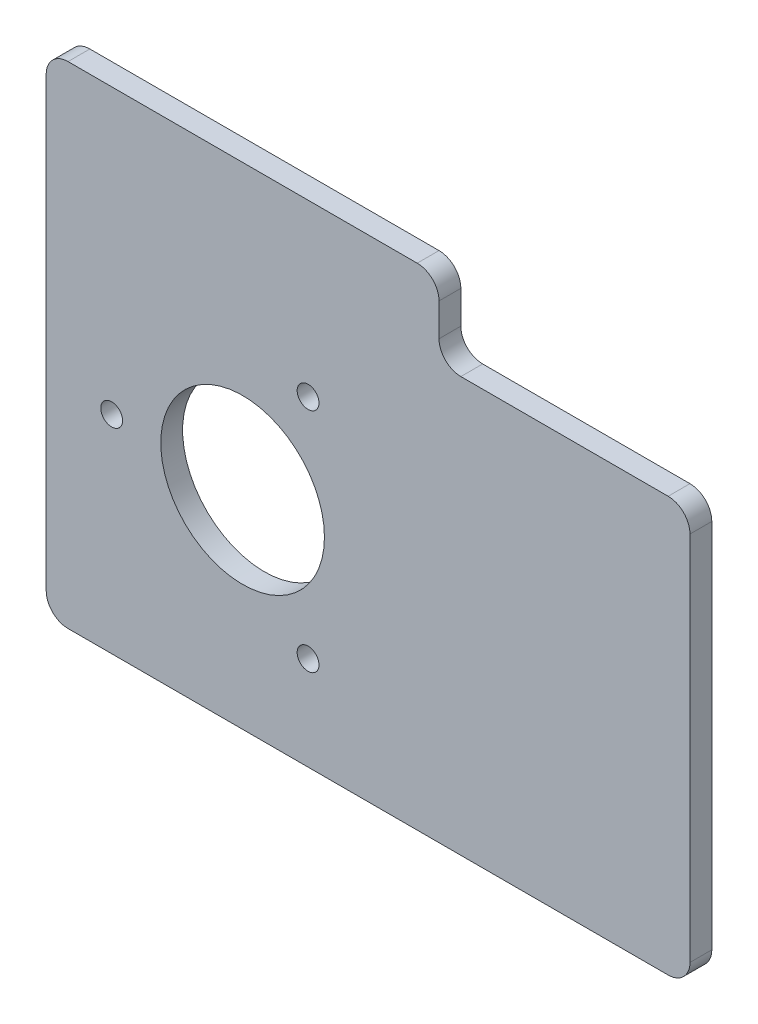
ISO-10303-21;
HEADER;
FILE_DESCRIPTION(('STEP AP214'),'2;1');
FILE_NAME('part.step','',(''),(''),'','','');
FILE_SCHEMA(('AUTOMOTIVE_DESIGN { 1 0 10303 214 1 1 1 1 }'));
ENDSEC;
DATA;
#1=APPLICATION_CONTEXT('core data for automotive mechanical design processes');
#2=APPLICATION_PROTOCOL_DEFINITION('international standard','automotive_design',2000,#1);
#3=PRODUCT_CONTEXT('',#1,'mechanical');
#4=PRODUCT('Part','Part','',(#3));
#5=PRODUCT_RELATED_PRODUCT_CATEGORY('part','',(#4));
#6=PRODUCT_DEFINITION_FORMATION('','',#4);
#7=PRODUCT_DEFINITION_CONTEXT('part definition',#1,'design');
#8=PRODUCT_DEFINITION('design','',#6,#7);
#9=PRODUCT_DEFINITION_SHAPE('','',#8);
#10=(LENGTH_UNIT() NAMED_UNIT(*) SI_UNIT(.MILLI.,.METRE.));
#11=(NAMED_UNIT(*) PLANE_ANGLE_UNIT() SI_UNIT($,.RADIAN.));
#12=(NAMED_UNIT(*) SI_UNIT($,.STERADIAN.) SOLID_ANGLE_UNIT());
#13=UNCERTAINTY_MEASURE_WITH_UNIT(LENGTH_MEASURE(1.E-05),#10,'distance_accuracy_value','');
#14=(GEOMETRIC_REPRESENTATION_CONTEXT(3) GLOBAL_UNCERTAINTY_ASSIGNED_CONTEXT((#13)) GLOBAL_UNIT_ASSIGNED_CONTEXT((#10,
#11,#12)) REPRESENTATION_CONTEXT('',''));
#15=CARTESIAN_POINT('',(0.,0.,0.));
#16=DIRECTION('',(0.,0.,1.));
#17=DIRECTION('',(1.,0.,0.));
#18=AXIS2_PLACEMENT_3D('',#15,#16,#17);
#19=CARTESIAN_POINT('',(0.,0.,1.));
#20=DIRECTION('',(0.,0.,-1.));
#21=DIRECTION('',(-1.,0.,0.));
#22=AXIS2_PLACEMENT_3D('',#19,#20,#21);
#23=PLANE('',#22);
#24=DIRECTION('',(1.,0.,0.));
#25=VECTOR('',#24,1.);
#26=CARTESIAN_POINT('',(-9.,-9.5,1.));
#27=LINE('',#26,#25);
#28=CARTESIAN_POINT('',(-8.,-9.5,1.));
#29=VERTEX_POINT('',#28);
#30=CARTESIAN_POINT('',(19.5,-9.5,1.));
#31=VERTEX_POINT('',#30);
#32=EDGE_CURVE('E242',#29,#31,#27,.T.);
#33=ORIENTED_EDGE('',*,*,#32,.T.);
#34=CARTESIAN_POINT('',(19.5,-8.49999999999999,1.));
#35=DIRECTION('',(0.,0.,-1.));
#36=DIRECTION('',(-1.,0.,0.));
#37=AXIS2_PLACEMENT_3D('',#34,#35,#36);
#38=CIRCLE('',#37,1.);
#39=CARTESIAN_POINT('',(20.5,-8.49999999999999,1.));
#40=VERTEX_POINT('',#39);
#41=EDGE_CURVE('E188',#31,#40,#38,.F.);
#42=ORIENTED_EDGE('',*,*,#41,.T.);
#43=DIRECTION('',(0.,1.,0.));
#44=VECTOR('',#43,1.);
#45=CARTESIAN_POINT('',(20.5,9.5,1.));
#46=LINE('',#45,#44);
#47=CARTESIAN_POINT('',(20.5,8.5,1.));
#48=VERTEX_POINT('',#47);
#49=EDGE_CURVE('E150',#40,#48,#46,.T.);
#50=ORIENTED_EDGE('',*,*,#49,.T.);
#51=CARTESIAN_POINT('',(19.5,8.5,1.));
#52=DIRECTION('',(0.,0.,-1.));
#53=DIRECTION('',(-1.,0.,0.));
#54=AXIS2_PLACEMENT_3D('',#51,#52,#53);
#55=CIRCLE('',#54,1.);
#56=CARTESIAN_POINT('',(19.5,9.5,1.));
#57=VERTEX_POINT('',#56);
#58=EDGE_CURVE('E182',#48,#57,#55,.F.);
#59=ORIENTED_EDGE('',*,*,#58,.T.);
#60=DIRECTION('',(-1.,0.,0.));
#61=VECTOR('',#60,1.);
#62=CARTESIAN_POINT('',(9.,9.5,1.));
#63=LINE('',#62,#61);
#64=CARTESIAN_POINT('',(10.,9.5,1.));
#65=VERTEX_POINT('',#64);
#66=EDGE_CURVE('E219',#57,#65,#63,.T.);
#67=ORIENTED_EDGE('',*,*,#66,.T.);
#68=CARTESIAN_POINT('',(10.,10.5,1.));
#69=DIRECTION('',(0.,0.,-1.));
#70=DIRECTION('',(-1.,0.,0.));
#71=AXIS2_PLACEMENT_3D('',#68,#69,#70);
#72=CIRCLE('',#71,1.);
#73=CARTESIAN_POINT('',(9.,10.5,1.));
#74=VERTEX_POINT('',#73);
#75=EDGE_CURVE('E11',#65,#74,#72,.T.);
#76=ORIENTED_EDGE('',*,*,#75,.T.);
#77=DIRECTION('',(0.,1.,0.));
#78=VECTOR('',#77,1.);
#79=CARTESIAN_POINT('',(9.,13.,1.));
#80=LINE('',#79,#78);
#81=CARTESIAN_POINT('',(9.,12.,1.));
#82=VERTEX_POINT('',#81);
#83=EDGE_CURVE('E170',#74,#82,#80,.T.);
#84=ORIENTED_EDGE('',*,*,#83,.T.);
#85=CARTESIAN_POINT('',(8.,12.,1.));
#86=DIRECTION('',(0.,0.,-1.));
#87=DIRECTION('',(-1.,0.,0.));
#88=AXIS2_PLACEMENT_3D('',#85,#86,#87);
#89=CIRCLE('',#88,1.);
#90=CARTESIAN_POINT('',(8.,13.,1.));
#91=VERTEX_POINT('',#90);
#92=EDGE_CURVE('E180',#82,#91,#89,.F.);
#93=ORIENTED_EDGE('',*,*,#92,.T.);
#94=DIRECTION('',(-1.,0.,0.));
#95=VECTOR('',#94,1.);
#96=CARTESIAN_POINT('',(-9.,13.,1.));
#97=LINE('',#96,#95);
#98=CARTESIAN_POINT('',(-8.,13.,1.));
#99=VERTEX_POINT('',#98);
#100=EDGE_CURVE('E169',#91,#99,#97,.T.);
#101=ORIENTED_EDGE('',*,*,#100,.T.);
#102=CARTESIAN_POINT('',(-8.,12.,1.));
#103=DIRECTION('',(0.,0.,-1.));
#104=DIRECTION('',(-1.,0.,0.));
#105=AXIS2_PLACEMENT_3D('',#102,#103,#104);
#106=CIRCLE('',#105,1.);
#107=CARTESIAN_POINT('',(-9.,12.,1.));
#108=VERTEX_POINT('',#107);
#109=EDGE_CURVE('E184',#99,#108,#106,.F.);
#110=ORIENTED_EDGE('',*,*,#109,.T.);
#111=DIRECTION('',(0.,-1.,0.));
#112=VECTOR('',#111,1.);
#113=CARTESIAN_POINT('',(-9.,13.,1.));
#114=LINE('',#113,#112);
#115=CARTESIAN_POINT('',(-9.,-8.49999999999999,1.));
#116=VERTEX_POINT('',#115);
#117=EDGE_CURVE('E243',#108,#116,#114,.T.);
#118=ORIENTED_EDGE('',*,*,#117,.T.);
#119=CARTESIAN_POINT('',(-8.,-8.5,1.));
#120=DIRECTION('',(0.,0.,-1.));
#121=DIRECTION('',(-1.,0.,0.));
#122=AXIS2_PLACEMENT_3D('',#119,#120,#121);
#123=CIRCLE('',#122,1.);
#124=EDGE_CURVE('E186',#116,#29,#123,.F.);
#125=ORIENTED_EDGE('',*,*,#124,.T.);
#126=EDGE_LOOP('',(#33,#42,#50,#59,#67,#76,#84,#93,#101,#110,#118,#125));
#127=FACE_BOUND('',#126,.T.);
#128=CARTESIAN_POINT('',(-6.,0.,1.));
#129=DIRECTION('',(0.,0.,1.));
#130=DIRECTION('',(1.,0.,0.));
#131=AXIS2_PLACEMENT_3D('',#128,#129,#130);
#132=CIRCLE('',#131,0.500000000000001);
#133=CARTESIAN_POINT('',(-5.5,0.,1.));
#134=VERTEX_POINT('',#133);
#135=EDGE_CURVE('E226',#134,#134,#132,.T.);
#136=ORIENTED_EDGE('',*,*,#135,.F.);
#137=EDGE_LOOP('',(#136));
#138=FACE_BOUND('',#137,.T.);
#139=CARTESIAN_POINT('',(0.,0.,1.));
#140=DIRECTION('',(0.,0.,1.));
#141=DIRECTION('',(1.,0.,0.));
#142=AXIS2_PLACEMENT_3D('',#139,#140,#141);
#143=CIRCLE('',#142,3.75);
#144=CARTESIAN_POINT('',(3.75,0.,1.));
#145=VERTEX_POINT('',#144);
#146=EDGE_CURVE('E254',#145,#145,#143,.T.);
#147=ORIENTED_EDGE('',*,*,#146,.F.);
#148=EDGE_LOOP('',(#147));
#149=FACE_BOUND('',#148,.T.);
#150=CARTESIAN_POINT('',(3.,5.19615242270663,1.));
#151=DIRECTION('',(0.,0.,1.));
#152=DIRECTION('',(1.,0.,0.));
#153=AXIS2_PLACEMENT_3D('',#150,#151,#152);
#154=CIRCLE('',#153,0.500000000000001);
#155=CARTESIAN_POINT('',(3.5,5.19615242270663,1.));
#156=VERTEX_POINT('',#155);
#157=EDGE_CURVE('E260',#156,#156,#154,.T.);
#158=ORIENTED_EDGE('',*,*,#157,.F.);
#159=EDGE_LOOP('',(#158));
#160=FACE_BOUND('',#159,.T.);
#161=CARTESIAN_POINT('',(3.,-5.19615242270663,1.));
#162=DIRECTION('',(0.,0.,1.));
#163=DIRECTION('',(1.,0.,0.));
#164=AXIS2_PLACEMENT_3D('',#161,#162,#163);
#165=CIRCLE('',#164,0.500000000000001);
#166=CARTESIAN_POINT('',(3.5,-5.19615242270663,1.));
#167=VERTEX_POINT('',#166);
#168=EDGE_CURVE('E266',#167,#167,#165,.T.);
#169=ORIENTED_EDGE('',*,*,#168,.F.);
#170=EDGE_LOOP('',(#169));
#171=FACE_BOUND('',#170,.T.);
#172=ADVANCED_FACE('F41',(#127,#138,#149,#160,#171),#23,.F.);
#173=CARTESIAN_POINT('',(0.,0.,0.));
#174=DIRECTION('',(0.,0.,-1.));
#175=DIRECTION('',(-1.,0.,0.));
#176=AXIS2_PLACEMENT_3D('',#173,#174,#175);
#177=PLANE('',#176);
#178=CARTESIAN_POINT('',(3.,5.19615242270663,0.));
#179=DIRECTION('',(0.,0.,1.));
#180=DIRECTION('',(1.,0.,0.));
#181=AXIS2_PLACEMENT_3D('',#178,#179,#180);
#182=CIRCLE('',#181,0.500000000000001);
#183=CARTESIAN_POINT('',(3.5,5.19615242270663,0.));
#184=VERTEX_POINT('',#183);
#185=EDGE_CURVE('E263',#184,#184,#182,.T.);
#186=ORIENTED_EDGE('',*,*,#185,.T.);
#187=EDGE_LOOP('',(#186));
#188=FACE_BOUND('',#187,.T.);
#189=CARTESIAN_POINT('',(-6.,0.,0.));
#190=DIRECTION('',(0.,0.,1.));
#191=DIRECTION('',(1.,0.,0.));
#192=AXIS2_PLACEMENT_3D('',#189,#190,#191);
#193=CIRCLE('',#192,0.500000000000001);
#194=CARTESIAN_POINT('',(-5.5,0.,0.));
#195=VERTEX_POINT('',#194);
#196=EDGE_CURVE('E251',#195,#195,#193,.T.);
#197=ORIENTED_EDGE('',*,*,#196,.T.);
#198=EDGE_LOOP('',(#197));
#199=FACE_BOUND('',#198,.T.);
#200=DIRECTION('',(0.,1.,0.));
#201=VECTOR('',#200,1.);
#202=CARTESIAN_POINT('',(20.5,9.5,0.));
#203=LINE('',#202,#201);
#204=CARTESIAN_POINT('',(20.5,-8.49999999999999,0.));
#205=VERTEX_POINT('',#204);
#206=CARTESIAN_POINT('',(20.5,8.5,0.));
#207=VERTEX_POINT('',#206);
#208=EDGE_CURVE('E147',#205,#207,#203,.T.);
#209=ORIENTED_EDGE('',*,*,#208,.F.);
#210=CARTESIAN_POINT('',(19.5,-8.49999999999999,0.));
#211=DIRECTION('',(0.,0.,-1.));
#212=DIRECTION('',(-1.,0.,0.));
#213=AXIS2_PLACEMENT_3D('',#210,#211,#212);
#214=CIRCLE('',#213,1.);
#215=CARTESIAN_POINT('',(19.5,-9.5,0.));
#216=VERTEX_POINT('',#215);
#217=EDGE_CURVE('E130',#205,#216,#214,.T.);
#218=ORIENTED_EDGE('',*,*,#217,.T.);
#219=DIRECTION('',(1.,0.,0.));
#220=VECTOR('',#219,1.);
#221=CARTESIAN_POINT('',(-9.,-9.5,0.));
#222=LINE('',#221,#220);
#223=CARTESIAN_POINT('',(-8.,-9.5,0.));
#224=VERTEX_POINT('',#223);
#225=EDGE_CURVE('E159',#224,#216,#222,.T.);
#226=ORIENTED_EDGE('',*,*,#225,.F.);
#227=CARTESIAN_POINT('',(-8.,-8.5,0.));
#228=DIRECTION('',(0.,0.,-1.));
#229=DIRECTION('',(-1.,0.,0.));
#230=AXIS2_PLACEMENT_3D('',#227,#228,#229);
#231=CIRCLE('',#230,1.);
#232=CARTESIAN_POINT('',(-9.,-8.49999999999999,0.));
#233=VERTEX_POINT('',#232);
#234=EDGE_CURVE('E141',#224,#233,#231,.T.);
#235=ORIENTED_EDGE('',*,*,#234,.T.);
#236=DIRECTION('',(0.,-1.,0.));
#237=VECTOR('',#236,1.);
#238=CARTESIAN_POINT('',(-9.,13.,0.));
#239=LINE('',#238,#237);
#240=CARTESIAN_POINT('',(-9.,12.,0.));
#241=VERTEX_POINT('',#240);
#242=EDGE_CURVE('E164',#241,#233,#239,.T.);
#243=ORIENTED_EDGE('',*,*,#242,.F.);
#244=CARTESIAN_POINT('',(-8.,12.,0.));
#245=DIRECTION('',(0.,0.,-1.));
#246=DIRECTION('',(-1.,0.,0.));
#247=AXIS2_PLACEMENT_3D('',#244,#245,#246);
#248=CIRCLE('',#247,1.);
#249=CARTESIAN_POINT('',(-8.,13.,0.));
#250=VERTEX_POINT('',#249);
#251=EDGE_CURVE('E174',#241,#250,#248,.T.);
#252=ORIENTED_EDGE('',*,*,#251,.T.);
#253=DIRECTION('',(-1.,0.,0.));
#254=VECTOR('',#253,1.);
#255=CARTESIAN_POINT('',(-9.,13.,0.));
#256=LINE('',#255,#254);
#257=CARTESIAN_POINT('',(8.,13.,0.));
#258=VERTEX_POINT('',#257);
#259=EDGE_CURVE('E224',#258,#250,#256,.T.);
#260=ORIENTED_EDGE('',*,*,#259,.F.);
#261=CARTESIAN_POINT('',(8.,12.,0.));
#262=DIRECTION('',(0.,0.,-1.));
#263=DIRECTION('',(-1.,0.,0.));
#264=AXIS2_PLACEMENT_3D('',#261,#262,#263);
#265=CIRCLE('',#264,1.);
#266=CARTESIAN_POINT('',(9.,12.,0.));
#267=VERTEX_POINT('',#266);
#268=EDGE_CURVE('E151',#258,#267,#265,.T.);
#269=ORIENTED_EDGE('',*,*,#268,.T.);
#270=DIRECTION('',(0.,1.,0.));
#271=VECTOR('',#270,1.);
#272=CARTESIAN_POINT('',(9.,13.,0.));
#273=LINE('',#272,#271);
#274=CARTESIAN_POINT('',(9.,10.5,0.));
#275=VERTEX_POINT('',#274);
#276=EDGE_CURVE('E162',#275,#267,#273,.T.);
#277=ORIENTED_EDGE('',*,*,#276,.F.);
#278=CARTESIAN_POINT('',(10.,10.5,0.));
#279=DIRECTION('',(0.,0.,-1.));
#280=DIRECTION('',(-1.,0.,0.));
#281=AXIS2_PLACEMENT_3D('',#278,#279,#280);
#282=CIRCLE('',#281,1.);
#283=CARTESIAN_POINT('',(10.,9.5,0.));
#284=VERTEX_POINT('',#283);
#285=EDGE_CURVE('E49',#275,#284,#282,.F.);
#286=ORIENTED_EDGE('',*,*,#285,.T.);
#287=DIRECTION('',(-1.,0.,0.));
#288=VECTOR('',#287,1.);
#289=CARTESIAN_POINT('',(9.,9.5,0.));
#290=LINE('',#289,#288);
#291=CARTESIAN_POINT('',(19.5,9.5,0.));
#292=VERTEX_POINT('',#291);
#293=EDGE_CURVE('E158',#292,#284,#290,.T.);
#294=ORIENTED_EDGE('',*,*,#293,.F.);
#295=CARTESIAN_POINT('',(19.5,8.5,0.));
#296=DIRECTION('',(0.,0.,-1.));
#297=DIRECTION('',(-1.,0.,0.));
#298=AXIS2_PLACEMENT_3D('',#295,#296,#297);
#299=CIRCLE('',#298,1.);
#300=EDGE_CURVE('E157',#292,#207,#299,.T.);
#301=ORIENTED_EDGE('',*,*,#300,.T.);
#302=EDGE_LOOP('',(#209,#218,#226,#235,#243,#252,#260,#269,#277,#286,#294,#301));
#303=FACE_BOUND('',#302,.T.);
#304=CARTESIAN_POINT('',(0.,0.,0.));
#305=DIRECTION('',(0.,0.,1.));
#306=DIRECTION('',(1.,0.,0.));
#307=AXIS2_PLACEMENT_3D('',#304,#305,#306);
#308=CIRCLE('',#307,3.75);
#309=CARTESIAN_POINT('',(3.75,0.,0.));
#310=VERTEX_POINT('',#309);
#311=EDGE_CURVE('E257',#310,#310,#308,.T.);
#312=ORIENTED_EDGE('',*,*,#311,.T.);
#313=EDGE_LOOP('',(#312));
#314=FACE_BOUND('',#313,.T.);
#315=CARTESIAN_POINT('',(3.,-5.19615242270663,0.));
#316=DIRECTION('',(0.,0.,1.));
#317=DIRECTION('',(1.,0.,0.));
#318=AXIS2_PLACEMENT_3D('',#315,#316,#317);
#319=CIRCLE('',#318,0.500000000000001);
#320=CARTESIAN_POINT('',(3.5,-5.19615242270663,0.));
#321=VERTEX_POINT('',#320);
#322=EDGE_CURVE('E269',#321,#321,#319,.T.);
#323=ORIENTED_EDGE('',*,*,#322,.T.);
#324=EDGE_LOOP('',(#323));
#325=FACE_BOUND('',#324,.T.);
#326=ADVANCED_FACE('F154',(#188,#199,#303,#314,#325),#177,.T.);
#327=CARTESIAN_POINT('',(-9.,13.,1.));
#328=DIRECTION('',(0.,-1.,0.));
#329=DIRECTION('',(0.,0.,-1.));
#330=AXIS2_PLACEMENT_3D('',#327,#328,#329);
#331=PLANE('',#330);
#332=ORIENTED_EDGE('',*,*,#259,.T.);
#333=DIRECTION('',(0.,0.,-1.));
#334=VECTOR('',#333,1.);
#335=CARTESIAN_POINT('',(-8.,13.,1.));
#336=LINE('',#335,#334);
#337=EDGE_CURVE('E198',#250,#99,#336,.F.);
#338=ORIENTED_EDGE('',*,*,#337,.T.);
#339=ORIENTED_EDGE('',*,*,#100,.F.);
#340=DIRECTION('',(0.,0.,-1.));
#341=VECTOR('',#340,1.);
#342=CARTESIAN_POINT('',(8.,13.,1.));
#343=LINE('',#342,#341);
#344=EDGE_CURVE('E195',#91,#258,#343,.T.);
#345=ORIENTED_EDGE('',*,*,#344,.T.);
#346=EDGE_LOOP('',(#332,#338,#339,#345));
#347=FACE_BOUND('',#346,.T.);
#348=ADVANCED_FACE('F283',(#347),#331,.F.);
#349=CARTESIAN_POINT('',(-9.,13.,1.));
#350=DIRECTION('',(1.,0.,0.));
#351=DIRECTION('',(0.,0.,-1.));
#352=AXIS2_PLACEMENT_3D('',#349,#350,#351);
#353=PLANE('',#352);
#354=ORIENTED_EDGE('',*,*,#242,.T.);
#355=DIRECTION('',(0.,0.,-1.));
#356=VECTOR('',#355,1.);
#357=CARTESIAN_POINT('',(-9.,-8.5,1.));
#358=LINE('',#357,#356);
#359=EDGE_CURVE('E193',#233,#116,#358,.F.);
#360=ORIENTED_EDGE('',*,*,#359,.T.);
#361=ORIENTED_EDGE('',*,*,#117,.F.);
#362=DIRECTION('',(0.,0.,-1.));
#363=VECTOR('',#362,1.);
#364=CARTESIAN_POINT('',(-9.,12.,1.));
#365=LINE('',#364,#363);
#366=EDGE_CURVE('E190',#108,#241,#365,.T.);
#367=ORIENTED_EDGE('',*,*,#366,.T.);
#368=EDGE_LOOP('',(#354,#360,#361,#367));
#369=FACE_BOUND('',#368,.T.);
#370=ADVANCED_FACE('F231',(#369),#353,.F.);
#371=CARTESIAN_POINT('',(-9.,-9.5,1.));
#372=DIRECTION('',(0.,1.,0.));
#373=DIRECTION('',(-1.,0.,0.));
#374=AXIS2_PLACEMENT_3D('',#371,#372,#373);
#375=PLANE('',#374);
#376=ORIENTED_EDGE('',*,*,#225,.T.);
#377=DIRECTION('',(0.,0.,-1.));
#378=VECTOR('',#377,1.);
#379=CARTESIAN_POINT('',(19.5,-9.5,1.));
#380=LINE('',#379,#378);
#381=EDGE_CURVE('E135',#216,#31,#380,.F.);
#382=ORIENTED_EDGE('',*,*,#381,.T.);
#383=ORIENTED_EDGE('',*,*,#32,.F.);
#384=DIRECTION('',(0.,0.,-1.));
#385=VECTOR('',#384,1.);
#386=CARTESIAN_POINT('',(-8.,-9.5,1.));
#387=LINE('',#386,#385);
#388=EDGE_CURVE('E140',#29,#224,#387,.T.);
#389=ORIENTED_EDGE('',*,*,#388,.T.);
#390=EDGE_LOOP('',(#376,#382,#383,#389));
#391=FACE_BOUND('',#390,.T.);
#392=ADVANCED_FACE('F245',(#391),#375,.F.);
#393=CARTESIAN_POINT('',(20.5,9.5,1.));
#394=DIRECTION('',(-1.,0.,0.));
#395=DIRECTION('',(0.,0.,1.));
#396=AXIS2_PLACEMENT_3D('',#393,#394,#395);
#397=PLANE('',#396);
#398=ORIENTED_EDGE('',*,*,#49,.F.);
#399=DIRECTION('',(0.,0.,-1.));
#400=VECTOR('',#399,1.);
#401=CARTESIAN_POINT('',(20.5,-8.49999999999999,1.));
#402=LINE('',#401,#400);
#403=EDGE_CURVE('E134',#40,#205,#402,.T.);
#404=ORIENTED_EDGE('',*,*,#403,.T.);
#405=ORIENTED_EDGE('',*,*,#208,.T.);
#406=DIRECTION('',(0.,0.,-1.));
#407=VECTOR('',#406,1.);
#408=CARTESIAN_POINT('',(20.5,8.5,1.));
#409=LINE('',#408,#407);
#410=EDGE_CURVE('E152',#207,#48,#409,.F.);
#411=ORIENTED_EDGE('',*,*,#410,.T.);
#412=EDGE_LOOP('',(#398,#404,#405,#411));
#413=FACE_BOUND('',#412,.T.);
#414=ADVANCED_FACE('F146',(#413),#397,.F.);
#415=CARTESIAN_POINT('',(9.,9.5,1.));
#416=DIRECTION('',(0.,-1.,0.));
#417=DIRECTION('',(1.,0.,0.));
#418=AXIS2_PLACEMENT_3D('',#415,#416,#417);
#419=PLANE('',#418);
#420=ORIENTED_EDGE('',*,*,#66,.F.);
#421=DIRECTION('',(0.,0.,-1.));
#422=VECTOR('',#421,1.);
#423=CARTESIAN_POINT('',(19.5,9.5,1.));
#424=LINE('',#423,#422);
#425=EDGE_CURVE('E202',#57,#292,#424,.T.);
#426=ORIENTED_EDGE('',*,*,#425,.T.);
#427=ORIENTED_EDGE('',*,*,#293,.T.);
#428=DIRECTION('',(0.,0.,-1.));
#429=VECTOR('',#428,1.);
#430=CARTESIAN_POINT('',(10.,9.5,1.));
#431=LINE('',#430,#429);
#432=EDGE_CURVE('E200',#284,#65,#431,.F.);
#433=ORIENTED_EDGE('',*,*,#432,.T.);
#434=EDGE_LOOP('',(#420,#426,#427,#433));
#435=FACE_BOUND('',#434,.T.);
#436=ADVANCED_FACE('F214',(#435),#419,.F.);
#437=CARTESIAN_POINT('',(9.,13.,1.));
#438=DIRECTION('',(-1.,0.,0.));
#439=DIRECTION('',(0.,-1.,0.));
#440=AXIS2_PLACEMENT_3D('',#437,#438,#439);
#441=PLANE('',#440);
#442=ORIENTED_EDGE('',*,*,#83,.F.);
#443=DIRECTION('',(0.,0.,-1.));
#444=VECTOR('',#443,1.);
#445=CARTESIAN_POINT('',(9.,10.5,0.));
#446=LINE('',#445,#444);
#447=EDGE_CURVE('E206',#74,#275,#446,.T.);
#448=ORIENTED_EDGE('',*,*,#447,.T.);
#449=ORIENTED_EDGE('',*,*,#276,.T.);
#450=DIRECTION('',(0.,0.,-1.));
#451=VECTOR('',#450,1.);
#452=CARTESIAN_POINT('',(9.,12.,1.));
#453=LINE('',#452,#451);
#454=EDGE_CURVE('E56',#267,#82,#453,.F.);
#455=ORIENTED_EDGE('',*,*,#454,.T.);
#456=EDGE_LOOP('',(#442,#448,#449,#455));
#457=FACE_BOUND('',#456,.T.);
#458=ADVANCED_FACE('F217',(#457),#441,.F.);
#459=CARTESIAN_POINT('',(-6.,0.,1.));
#460=DIRECTION('',(0.,0.,-1.));
#461=DIRECTION('',(-1.,0.,0.));
#462=AXIS2_PLACEMENT_3D('',#459,#460,#461);
#463=CYLINDRICAL_SURFACE('',#462,0.500000000000001);
#464=ORIENTED_EDGE('',*,*,#135,.T.);
#465=EDGE_LOOP('',(#464));
#466=FACE_BOUND('',#465,.T.);
#467=ORIENTED_EDGE('',*,*,#196,.F.);
#468=EDGE_LOOP('',(#467));
#469=FACE_BOUND('',#468,.T.);
#470=ADVANCED_FACE('F287',(#466,#469),#463,.F.);
#471=CARTESIAN_POINT('',(0.,0.,1.));
#472=DIRECTION('',(0.,0.,-1.));
#473=DIRECTION('',(-1.,0.,0.));
#474=AXIS2_PLACEMENT_3D('',#471,#472,#473);
#475=CYLINDRICAL_SURFACE('',#474,3.75);
#476=ORIENTED_EDGE('',*,*,#146,.T.);
#477=EDGE_LOOP('',(#476));
#478=FACE_BOUND('',#477,.T.);
#479=ORIENTED_EDGE('',*,*,#311,.F.);
#480=EDGE_LOOP('',(#479));
#481=FACE_BOUND('',#480,.T.);
#482=ADVANCED_FACE('F423',(#478,#481),#475,.F.);
#483=CARTESIAN_POINT('',(3.,5.19615242270663,1.));
#484=DIRECTION('',(0.,0.,-1.));
#485=DIRECTION('',(-1.,0.,0.));
#486=AXIS2_PLACEMENT_3D('',#483,#484,#485);
#487=CYLINDRICAL_SURFACE('',#486,0.500000000000001);
#488=ORIENTED_EDGE('',*,*,#157,.T.);
#489=EDGE_LOOP('',(#488));
#490=FACE_BOUND('',#489,.T.);
#491=ORIENTED_EDGE('',*,*,#185,.F.);
#492=EDGE_LOOP('',(#491));
#493=FACE_BOUND('',#492,.T.);
#494=ADVANCED_FACE('F414',(#490,#493),#487,.F.);
#495=CARTESIAN_POINT('',(3.,-5.19615242270663,1.));
#496=DIRECTION('',(0.,0.,-1.));
#497=DIRECTION('',(-1.,0.,0.));
#498=AXIS2_PLACEMENT_3D('',#495,#496,#497);
#499=CYLINDRICAL_SURFACE('',#498,0.500000000000001);
#500=ORIENTED_EDGE('',*,*,#168,.T.);
#501=EDGE_LOOP('',(#500));
#502=FACE_BOUND('',#501,.T.);
#503=ORIENTED_EDGE('',*,*,#322,.F.);
#504=EDGE_LOOP('',(#503));
#505=FACE_BOUND('',#504,.T.);
#506=ADVANCED_FACE('F275',(#502,#505),#499,.F.);
#507=CARTESIAN_POINT('',(19.5,-8.49999999999999,1.));
#508=DIRECTION('',(0.,0.,-1.));
#509=DIRECTION('',(-1.,0.,0.));
#510=AXIS2_PLACEMENT_3D('',#507,#508,#509);
#511=CYLINDRICAL_SURFACE('',#510,1.);
#512=ORIENTED_EDGE('',*,*,#41,.F.);
#513=ORIENTED_EDGE('',*,*,#381,.F.);
#514=ORIENTED_EDGE('',*,*,#217,.F.);
#515=ORIENTED_EDGE('',*,*,#403,.F.);
#516=EDGE_LOOP('',(#512,#513,#514,#515));
#517=FACE_BOUND('',#516,.T.);
#518=ADVANCED_FACE('F133',(#517),#511,.T.);
#519=CARTESIAN_POINT('',(-8.,-8.5,1.));
#520=DIRECTION('',(0.,0.,-1.));
#521=DIRECTION('',(-1.,0.,0.));
#522=AXIS2_PLACEMENT_3D('',#519,#520,#521);
#523=CYLINDRICAL_SURFACE('',#522,1.);
#524=ORIENTED_EDGE('',*,*,#124,.F.);
#525=ORIENTED_EDGE('',*,*,#359,.F.);
#526=ORIENTED_EDGE('',*,*,#234,.F.);
#527=ORIENTED_EDGE('',*,*,#388,.F.);
#528=EDGE_LOOP('',(#524,#525,#526,#527));
#529=FACE_BOUND('',#528,.T.);
#530=ADVANCED_FACE('F237',(#529),#523,.T.);
#531=CARTESIAN_POINT('',(-8.,12.,1.));
#532=DIRECTION('',(0.,0.,-1.));
#533=DIRECTION('',(-1.,0.,0.));
#534=AXIS2_PLACEMENT_3D('',#531,#532,#533);
#535=CYLINDRICAL_SURFACE('',#534,1.);
#536=ORIENTED_EDGE('',*,*,#109,.F.);
#537=ORIENTED_EDGE('',*,*,#337,.F.);
#538=ORIENTED_EDGE('',*,*,#251,.F.);
#539=ORIENTED_EDGE('',*,*,#366,.F.);
#540=EDGE_LOOP('',(#536,#537,#538,#539));
#541=FACE_BOUND('',#540,.T.);
#542=ADVANCED_FACE('F307',(#541),#535,.T.);
#543=CARTESIAN_POINT('',(19.5,8.5,1.));
#544=DIRECTION('',(0.,0.,-1.));
#545=DIRECTION('',(-1.,0.,0.));
#546=AXIS2_PLACEMENT_3D('',#543,#544,#545);
#547=CYLINDRICAL_SURFACE('',#546,1.);
#548=ORIENTED_EDGE('',*,*,#58,.F.);
#549=ORIENTED_EDGE('',*,*,#410,.F.);
#550=ORIENTED_EDGE('',*,*,#300,.F.);
#551=ORIENTED_EDGE('',*,*,#425,.F.);
#552=EDGE_LOOP('',(#548,#549,#550,#551));
#553=FACE_BOUND('',#552,.T.);
#554=ADVANCED_FACE('F310',(#553),#547,.T.);
#555=CARTESIAN_POINT('',(10.,10.5,1.));
#556=DIRECTION('',(0.,0.,1.));
#557=DIRECTION('',(1.,0.,0.));
#558=AXIS2_PLACEMENT_3D('',#555,#556,#557);
#559=CYLINDRICAL_SURFACE('',#558,1.);
#560=ORIENTED_EDGE('',*,*,#75,.F.);
#561=ORIENTED_EDGE('',*,*,#432,.F.);
#562=ORIENTED_EDGE('',*,*,#285,.F.);
#563=ORIENTED_EDGE('',*,*,#447,.F.);
#564=EDGE_LOOP('',(#560,#561,#562,#563));
#565=FACE_BOUND('',#564,.T.);
#566=ADVANCED_FACE('F216',(#565),#559,.F.);
#567=CARTESIAN_POINT('',(8.,12.,1.));
#568=DIRECTION('',(0.,0.,-1.));
#569=DIRECTION('',(-1.,0.,0.));
#570=AXIS2_PLACEMENT_3D('',#567,#568,#569);
#571=CYLINDRICAL_SURFACE('',#570,1.);
#572=ORIENTED_EDGE('',*,*,#92,.F.);
#573=ORIENTED_EDGE('',*,*,#454,.F.);
#574=ORIENTED_EDGE('',*,*,#268,.F.);
#575=ORIENTED_EDGE('',*,*,#344,.F.);
#576=EDGE_LOOP('',(#572,#573,#574,#575));
#577=FACE_BOUND('',#576,.T.);
#578=ADVANCED_FACE('F43',(#577),#571,.T.);
#579=CLOSED_SHELL('',(#172,#326,#348,#370,#392,#414,#436,#458,#470,#482,#494,#506,#518,#530,
#542,#554,#566,#578));
#580=MANIFOLD_SOLID_BREP('B2',#579);
#581=ADVANCED_BREP_SHAPE_REPRESENTATION('',(#18,#580),#14);
#582=SHAPE_DEFINITION_REPRESENTATION(#9,#581);
ENDSEC;
END-ISO-10303-21;
